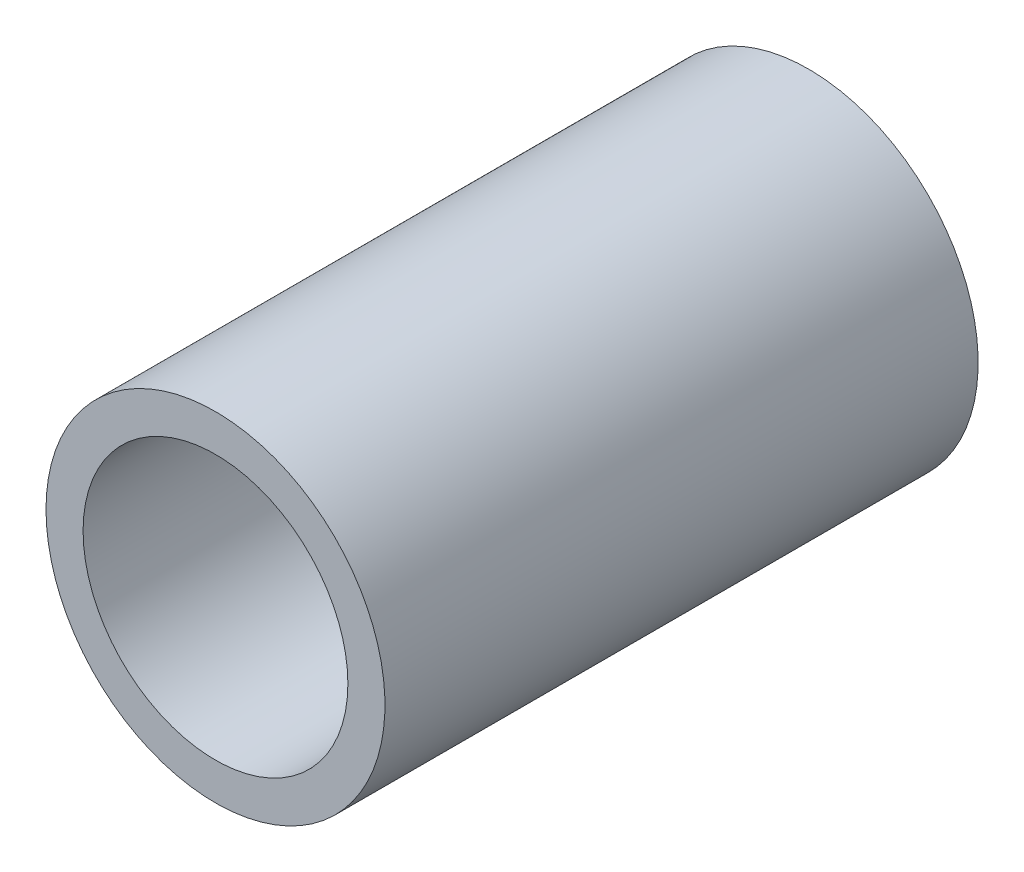
ISO-10303-21;
HEADER;
FILE_DESCRIPTION(('STEP AP214'),'2;1');
FILE_NAME('part.step','',(''),(''),'','','');
FILE_SCHEMA(('AUTOMOTIVE_DESIGN { 1 0 10303 214 1 1 1 1 }'));
ENDSEC;
DATA;
#1=APPLICATION_CONTEXT('core data for automotive mechanical design processes');
#2=APPLICATION_PROTOCOL_DEFINITION('international standard','automotive_design',2000,#1);
#3=PRODUCT_CONTEXT('',#1,'mechanical');
#4=PRODUCT('Part','Part','',(#3));
#5=PRODUCT_RELATED_PRODUCT_CATEGORY('part','',(#4));
#6=PRODUCT_DEFINITION_FORMATION('','',#4);
#7=PRODUCT_DEFINITION_CONTEXT('part definition',#1,'design');
#8=PRODUCT_DEFINITION('design','',#6,#7);
#9=PRODUCT_DEFINITION_SHAPE('','',#8);
#10=(LENGTH_UNIT() NAMED_UNIT(*) SI_UNIT(.MILLI.,.METRE.));
#11=(NAMED_UNIT(*) PLANE_ANGLE_UNIT() SI_UNIT($,.RADIAN.));
#12=(NAMED_UNIT(*) SI_UNIT($,.STERADIAN.) SOLID_ANGLE_UNIT());
#13=UNCERTAINTY_MEASURE_WITH_UNIT(LENGTH_MEASURE(1.E-05),#10,'distance_accuracy_value','');
#14=(GEOMETRIC_REPRESENTATION_CONTEXT(3) GLOBAL_UNCERTAINTY_ASSIGNED_CONTEXT((#13)) GLOBAL_UNIT_ASSIGNED_CONTEXT((#10,
#11,#12)) REPRESENTATION_CONTEXT('',''));
#15=CARTESIAN_POINT('',(0.,0.,0.));
#16=DIRECTION('',(0.,0.,1.));
#17=DIRECTION('',(1.,0.,0.));
#18=AXIS2_PLACEMENT_3D('',#15,#16,#17);
#19=CARTESIAN_POINT('',(-4.44089209850063E-13,8.88178419700125E-13,28.0000000000022));
#20=DIRECTION('',(0.,0.,0.999999999999999));
#21=DIRECTION('',(0.999999999999999,0.,0.));
#22=AXIS2_PLACEMENT_3D('',#19,#20,#21);
#23=PLANE('',#22);
#24=CARTESIAN_POINT('',(-4.44089209850063E-13,8.88178419700125E-13,28.0000000000022));
#25=DIRECTION('',(0.,0.,0.999999999999999));
#26=DIRECTION('',(0.999999999999999,0.,0.));
#27=AXIS2_PLACEMENT_3D('',#24,#25,#26);
#28=CIRCLE('',#27,8.);
#29=CARTESIAN_POINT('',(-8.00000000000043,8.84406019556125E-13,28.0000000000022));
#30=VERTEX_POINT('',#29);
#31=EDGE_CURVE('E10',#30,#30,#28,.T.);
#32=ORIENTED_EDGE('',*,*,#31,.T.);
#33=EDGE_LOOP('',(#32));
#34=FACE_BOUND('',#33,.T.);
#35=CARTESIAN_POINT('',(-4.44089209850063E-13,8.88178419700125E-13,28.0000000000022));
#36=DIRECTION('',(0.,0.,0.999999999999999));
#37=DIRECTION('',(0.999999999999999,0.,0.));
#38=AXIS2_PLACEMENT_3D('',#35,#36,#37);
#39=CIRCLE('',#38,6.25);
#40=CARTESIAN_POINT('',(-6.25000000000044,8.85231232087625E-13,28.0000000000022));
#41=VERTEX_POINT('',#40);
#42=EDGE_CURVE('E39',#41,#41,#39,.T.);
#43=ORIENTED_EDGE('',*,*,#42,.F.);
#44=EDGE_LOOP('',(#43));
#45=FACE_BOUND('',#44,.T.);
#46=ADVANCED_FACE('F28',(#34,#45),#23,.T.);
#47=CARTESIAN_POINT('',(0.,0.,0.));
#48=DIRECTION('',(0.,0.,0.999999999999999));
#49=DIRECTION('',(0.999999999999999,0.,0.));
#50=AXIS2_PLACEMENT_3D('',#47,#48,#49);
#51=PLANE('',#50);
#52=CARTESIAN_POINT('',(0.,0.,0.));
#53=DIRECTION('',(0.,0.,0.999999999999999));
#54=DIRECTION('',(0.999999999999999,0.,0.));
#55=AXIS2_PLACEMENT_3D('',#52,#53,#54);
#56=CIRCLE('',#55,8.);
#57=CARTESIAN_POINT('',(-8.00000000000043,8.8444244874912E-13,0.));
#58=VERTEX_POINT('',#57);
#59=EDGE_CURVE('E32',#58,#58,#56,.T.);
#60=ORIENTED_EDGE('',*,*,#59,.F.);
#61=EDGE_LOOP('',(#60));
#62=FACE_BOUND('',#61,.T.);
#63=CARTESIAN_POINT('',(0.,0.,0.));
#64=DIRECTION('',(0.,0.,0.999999999999999));
#65=DIRECTION('',(0.999999999999999,0.,0.));
#66=AXIS2_PLACEMENT_3D('',#63,#64,#65);
#67=CIRCLE('',#66,6.25);
#68=CARTESIAN_POINT('',(-6.25000000000044,8.8526766128062E-13,0.));
#69=VERTEX_POINT('',#68);
#70=EDGE_CURVE('E41',#69,#69,#67,.T.);
#71=ORIENTED_EDGE('',*,*,#70,.T.);
#72=EDGE_LOOP('',(#71));
#73=FACE_BOUND('',#72,.T.);
#74=ADVANCED_FACE('F51',(#62,#73),#51,.F.);
#75=CARTESIAN_POINT('',(-4.44089209850063E-13,8.88178419700125E-13,28.0000000000022));
#76=DIRECTION('',(0.,0.,-0.999999999999999));
#77=DIRECTION('',(-0.999999999999999,0.,0.));
#78=AXIS2_PLACEMENT_3D('',#75,#76,#77);
#79=CYLINDRICAL_SURFACE('',#78,8.);
#80=CARTESIAN_POINT('',(-8.00000000000043,8.84406019556125E-13,28.0000000000022));
#81=CARTESIAN_POINT('',(-8.00000000000043,8.84406399026885E-13,27.7083333333356));
#82=CARTESIAN_POINT('',(-8.00000000000043,8.84406778497646E-13,27.4166666666689));
#83=CARTESIAN_POINT('',(-8.00000000000043,8.84407537439166E-13,26.8333333333355));
#84=CARTESIAN_POINT('',(-8.00000000000043,8.84407916909927E-13,26.5416666666688));
#85=CARTESIAN_POINT('',(-8.00000000000043,8.84408675851447E-13,25.9583333333354));
#86=CARTESIAN_POINT('',(-8.00000000000043,8.84409055322208E-13,25.6666666666687));
#87=CARTESIAN_POINT('',(-8.00000000000043,8.84409814263729E-13,25.0833333333353));
#88=CARTESIAN_POINT('',(-8.00000000000043,8.84410193734489E-13,24.7916666666687));
#89=CARTESIAN_POINT('',(-8.00000000000043,8.8441095267601E-13,24.2083333333353));
#90=CARTESIAN_POINT('',(-8.00000000000043,8.8441133214677E-13,23.9166666666686));
#91=CARTESIAN_POINT('',(-8.00000000000043,8.84412091088291E-13,23.3333333333352));
#92=CARTESIAN_POINT('',(-8.00000000000043,8.84412470559051E-13,23.0416666666685));
#93=CARTESIAN_POINT('',(-8.00000000000043,8.84413229500572E-13,22.4583333333351));
#94=CARTESIAN_POINT('',(-8.00000000000043,8.84413608971332E-13,22.1666666666684));
#95=CARTESIAN_POINT('',(-8.00000000000043,8.84414367912853E-13,21.5833333333351));
#96=CARTESIAN_POINT('',(-8.00000000000043,8.84414747383613E-13,21.2916666666684));
#97=CARTESIAN_POINT('',(-8.00000000000043,8.84415506325134E-13,20.708333333335));
#98=CARTESIAN_POINT('',(-8.00000000000043,8.84415885795894E-13,20.4166666666683));
#99=CARTESIAN_POINT('',(-8.00000000000043,8.84416644737415E-13,19.8333333333349));
#100=CARTESIAN_POINT('',(-8.00000000000043,8.84417024208176E-13,19.5416666666682));
#101=CARTESIAN_POINT('',(-8.00000000000043,8.84417783149696E-13,18.9583333333349));
#102=CARTESIAN_POINT('',(-8.00000000000043,8.84418162620457E-13,18.6666666666682));
#103=CARTESIAN_POINT('',(-8.00000000000043,8.84418921561977E-13,18.0833333333348));
#104=CARTESIAN_POINT('',(-8.00000000000043,8.84419301032738E-13,17.7916666666681));
#105=CARTESIAN_POINT('',(-8.00000000000043,8.84420059974259E-13,17.2083333333347));
#106=CARTESIAN_POINT('',(-8.00000000000043,8.84420439445019E-13,16.916666666668));
#107=CARTESIAN_POINT('',(-8.00000000000043,8.8442119838654E-13,16.3333333333346));
#108=CARTESIAN_POINT('',(-8.00000000000043,8.844215778573E-13,16.041666666668));
#109=CARTESIAN_POINT('',(-8.00000000000043,8.84422336798821E-13,15.4583333333346));
#110=CARTESIAN_POINT('',(-8.00000000000043,8.84422716269581E-13,15.1666666666679));
#111=CARTESIAN_POINT('',(-8.00000000000043,8.84423475211102E-13,14.5833333333345));
#112=CARTESIAN_POINT('',(-8.00000000000043,8.84423854681862E-13,14.2916666666678));
#113=CARTESIAN_POINT('',(-8.00000000000043,8.84424613623383E-13,13.7083333333344));
#114=CARTESIAN_POINT('',(-8.00000000000043,8.84424993094143E-13,13.4166666666677));
#115=CARTESIAN_POINT('',(-8.00000000000043,8.84425752035664E-13,12.8333333333344));
#116=CARTESIAN_POINT('',(-8.00000000000043,8.84426131506425E-13,12.5416666666677));
#117=CARTESIAN_POINT('',(-8.00000000000043,8.84426890447945E-13,11.9583333333343));
#118=CARTESIAN_POINT('',(-8.00000000000043,8.84427269918706E-13,11.6666666666676));
#119=CARTESIAN_POINT('',(-8.00000000000043,8.84428028860226E-13,11.0833333333342));
#120=CARTESIAN_POINT('',(-8.00000000000043,8.84428408330987E-13,10.7916666666675));
#121=CARTESIAN_POINT('',(-8.00000000000043,8.84429167272507E-13,10.2083333333342));
#122=CARTESIAN_POINT('',(-8.00000000000043,8.84429546743268E-13,9.91666666666747));
#123=CARTESIAN_POINT('',(-8.00000000000043,8.84430305684789E-13,9.33333333333409));
#124=CARTESIAN_POINT('',(-8.00000000000043,8.84430685155549E-13,9.04166666666739));
#125=CARTESIAN_POINT('',(-8.00000000000043,8.8443144409707E-13,8.45833333333401));
#126=CARTESIAN_POINT('',(-8.00000000000043,8.8443182356783E-13,8.16666666666733));
#127=CARTESIAN_POINT('',(-8.00000000000043,8.84432582509351E-13,7.58333333333394));
#128=CARTESIAN_POINT('',(-8.00000000000043,8.84432961980111E-13,7.29166666666725));
#129=CARTESIAN_POINT('',(-8.00000000000043,8.84433720921632E-13,6.70833333333387));
#130=CARTESIAN_POINT('',(-8.00000000000043,8.84434100392392E-13,6.41666666666718));
#131=CARTESIAN_POINT('',(-8.00000000000043,8.84434859333913E-13,5.8333333333338));
#132=CARTESIAN_POINT('',(-8.00000000000043,8.84435238804673E-13,5.54166666666711));
#133=CARTESIAN_POINT('',(-8.00000000000043,8.84435997746194E-13,4.95833333333373));
#134=CARTESIAN_POINT('',(-8.00000000000043,8.84436377216955E-13,4.66666666666704));
#135=CARTESIAN_POINT('',(-8.00000000000043,8.84437136158475E-13,4.08333333333366));
#136=CARTESIAN_POINT('',(-8.00000000000043,8.84437515629236E-13,3.79166666666697));
#137=CARTESIAN_POINT('',(-8.00000000000043,8.84438274570756E-13,3.20833333333359));
#138=CARTESIAN_POINT('',(-8.00000000000043,8.84438654041517E-13,2.9166666666669));
#139=CARTESIAN_POINT('',(-8.00000000000043,8.84439412983037E-13,2.33333333333352));
#140=CARTESIAN_POINT('',(-8.00000000000043,8.84439792453798E-13,2.04166666666683));
#141=CARTESIAN_POINT('',(-8.00000000000043,8.84440551395318E-13,1.45833333333345));
#142=CARTESIAN_POINT('',(-8.00000000000043,8.84440930866079E-13,1.16666666666676));
#143=CARTESIAN_POINT('',(-8.00000000000043,8.844416898076E-13,0.583333333333383));
#144=CARTESIAN_POINT('',(-8.00000000000043,8.8444206927836E-13,0.291666666666693));
#145=CARTESIAN_POINT('',(-8.00000000000043,8.8444244874912E-13,0.));
#146=B_SPLINE_CURVE_WITH_KNOTS('',3,(#80,#81,#82,#83,#84,#85,#86,#87,#88,#89,#90,#91,#92,#93,
#94,#95,#96,#97,#98,#99,#100,#101,#102,#103,#104,#105,#106,#107,#108,#109,#110,#111,#112,#113,
#114,#115,#116,#117,#118,#119,#120,#121,#122,#123,#124,#125,#126,#127,#128,#129,#130,#131,#132,
#133,#134,#135,#136,#137,#138,#139,#140,#141,#142,#143,#144,#145),.UNSPECIFIED.,.F.,.F.,(4,2,2,
2,2,2,2,2,2,2,2,2,2,2,2,2,2,2,2,2,2,2,2,2,2,2,2,2,2,2,2,2,4),(0.,0.875000000000074,
1.75000000000014,2.62500000000021,3.50000000000028,4.37500000000035,5.25000000000042,
6.12500000000049,7.00000000000056,7.87500000000064,8.75000000000071,9.62500000000077,
10.5000000000008,11.3750000000009,12.250000000001,13.1250000000011,14.0000000000011,
14.8750000000012,15.7500000000013,16.6250000000013,17.5000000000014,18.3750000000015,
19.2500000000015,20.1250000000016,21.0000000000017,21.8750000000018,22.7500000000018,
23.6250000000019,24.500000000002,25.375000000002,26.2500000000021,27.1250000000022,
28.0000000000022),.UNSPECIFIED.);
#147=EDGE_CURVE('BSEAM30',#30,#58,#146,.T.);
#148=ORIENTED_EDGE('',*,*,#31,.F.);
#149=ORIENTED_EDGE('',*,*,#59,.T.);
#150=ORIENTED_EDGE('',*,*,#147,.T.);
#151=ORIENTED_EDGE('',*,*,#147,.F.);
#152=EDGE_LOOP('',(#148,#150,#149,#151));
#153=FACE_BOUND('',#152,.T.);
#154=ADVANCED_FACE('F30',(#153),#79,.T.);
#155=CARTESIAN_POINT('',(-4.44089209850063E-13,8.88178419700125E-13,28.0000000000022));
#156=DIRECTION('',(0.,0.,-0.999999999999999));
#157=DIRECTION('',(-0.999999999999999,0.,0.));
#158=AXIS2_PLACEMENT_3D('',#155,#156,#157);
#159=CYLINDRICAL_SURFACE('',#158,6.25);
#160=CARTESIAN_POINT('',(-6.25000000000044,8.85231232087625E-13,28.0000000000022));
#161=CARTESIAN_POINT('',(-6.25000000000044,8.85231611558385E-13,27.7083333333356));
#162=CARTESIAN_POINT('',(-6.25000000000044,8.85231991029146E-13,27.4166666666689));
#163=CARTESIAN_POINT('',(-6.25000000000044,8.85232749970666E-13,26.8333333333355));
#164=CARTESIAN_POINT('',(-6.25000000000044,8.85233129441427E-13,26.5416666666688));
#165=CARTESIAN_POINT('',(-6.25000000000044,8.85233888382947E-13,25.9583333333354));
#166=CARTESIAN_POINT('',(-6.25000000000044,8.85234267853708E-13,25.6666666666687));
#167=CARTESIAN_POINT('',(-6.25000000000044,8.85235026795229E-13,25.0833333333353));
#168=CARTESIAN_POINT('',(-6.25000000000044,8.85235406265989E-13,24.7916666666687));
#169=CARTESIAN_POINT('',(-6.25000000000044,8.8523616520751E-13,24.2083333333353));
#170=CARTESIAN_POINT('',(-6.25000000000044,8.8523654467827E-13,23.9166666666686));
#171=CARTESIAN_POINT('',(-6.25000000000044,8.85237303619791E-13,23.3333333333352));
#172=CARTESIAN_POINT('',(-6.25000000000044,8.85237683090551E-13,23.0416666666685));
#173=CARTESIAN_POINT('',(-6.25000000000044,8.85238442032072E-13,22.4583333333351));
#174=CARTESIAN_POINT('',(-6.25000000000044,8.85238821502832E-13,22.1666666666684));
#175=CARTESIAN_POINT('',(-6.25000000000044,8.85239580444353E-13,21.5833333333351));
#176=CARTESIAN_POINT('',(-6.25000000000044,8.85239959915113E-13,21.2916666666684));
#177=CARTESIAN_POINT('',(-6.25000000000044,8.85240718856634E-13,20.708333333335));
#178=CARTESIAN_POINT('',(-6.25000000000044,8.85241098327395E-13,20.4166666666683));
#179=CARTESIAN_POINT('',(-6.25000000000044,8.85241857268915E-13,19.8333333333349));
#180=CARTESIAN_POINT('',(-6.25000000000044,8.85242236739676E-13,19.5416666666682));
#181=CARTESIAN_POINT('',(-6.25000000000044,8.85242995681196E-13,18.9583333333349));
#182=CARTESIAN_POINT('',(-6.25000000000044,8.85243375151957E-13,18.6666666666682));
#183=CARTESIAN_POINT('',(-6.25000000000044,8.85244134093477E-13,18.0833333333348));
#184=CARTESIAN_POINT('',(-6.25000000000044,8.85244513564238E-13,17.7916666666681));
#185=CARTESIAN_POINT('',(-6.25000000000044,8.85245272505759E-13,17.2083333333347));
#186=CARTESIAN_POINT('',(-6.25000000000044,8.85245651976519E-13,16.916666666668));
#187=CARTESIAN_POINT('',(-6.25000000000044,8.8524641091804E-13,16.3333333333346));
#188=CARTESIAN_POINT('',(-6.25000000000044,8.852467903888E-13,16.041666666668));
#189=CARTESIAN_POINT('',(-6.25000000000044,8.85247549330321E-13,15.4583333333346));
#190=CARTESIAN_POINT('',(-6.25000000000044,8.85247928801081E-13,15.1666666666679));
#191=CARTESIAN_POINT('',(-6.25000000000044,8.85248687742602E-13,14.5833333333345));
#192=CARTESIAN_POINT('',(-6.25000000000044,8.85249067213362E-13,14.2916666666678));
#193=CARTESIAN_POINT('',(-6.25000000000044,8.85249826154883E-13,13.7083333333344));
#194=CARTESIAN_POINT('',(-6.25000000000044,8.85250205625643E-13,13.4166666666677));
#195=CARTESIAN_POINT('',(-6.25000000000044,8.85250964567164E-13,12.8333333333344));
#196=CARTESIAN_POINT('',(-6.25000000000044,8.85251344037925E-13,12.5416666666677));
#197=CARTESIAN_POINT('',(-6.25000000000044,8.85252102979445E-13,11.9583333333343));
#198=CARTESIAN_POINT('',(-6.25000000000044,8.85252482450206E-13,11.6666666666676));
#199=CARTESIAN_POINT('',(-6.25000000000044,8.85253241391726E-13,11.0833333333342));
#200=CARTESIAN_POINT('',(-6.25000000000044,8.85253620862487E-13,10.7916666666675));
#201=CARTESIAN_POINT('',(-6.25000000000044,8.85254379804007E-13,10.2083333333342));
#202=CARTESIAN_POINT('',(-6.25000000000044,8.85254759274768E-13,9.91666666666747));
#203=CARTESIAN_POINT('',(-6.25000000000044,8.85255518216289E-13,9.33333333333409));
#204=CARTESIAN_POINT('',(-6.25000000000044,8.85255897687049E-13,9.04166666666739));
#205=CARTESIAN_POINT('',(-6.25000000000044,8.8525665662857E-13,8.45833333333401));
#206=CARTESIAN_POINT('',(-6.25000000000044,8.8525703609933E-13,8.16666666666733));
#207=CARTESIAN_POINT('',(-6.25000000000044,8.85257795040851E-13,7.58333333333394));
#208=CARTESIAN_POINT('',(-6.25000000000044,8.85258174511611E-13,7.29166666666725));
#209=CARTESIAN_POINT('',(-6.25000000000044,8.85258933453132E-13,6.70833333333387));
#210=CARTESIAN_POINT('',(-6.25000000000044,8.85259312923892E-13,6.41666666666718));
#211=CARTESIAN_POINT('',(-6.25000000000044,8.85260071865413E-13,5.8333333333338));
#212=CARTESIAN_POINT('',(-6.25000000000044,8.85260451336173E-13,5.54166666666711));
#213=CARTESIAN_POINT('',(-6.25000000000044,8.85261210277694E-13,4.95833333333373));
#214=CARTESIAN_POINT('',(-6.25000000000044,8.85261589748455E-13,4.66666666666704));
#215=CARTESIAN_POINT('',(-6.25000000000044,8.85262348689975E-13,4.08333333333366));
#216=CARTESIAN_POINT('',(-6.25000000000044,8.85262728160736E-13,3.79166666666697));
#217=CARTESIAN_POINT('',(-6.25000000000044,8.85263487102256E-13,3.20833333333359));
#218=CARTESIAN_POINT('',(-6.25000000000044,8.85263866573017E-13,2.9166666666669));
#219=CARTESIAN_POINT('',(-6.25000000000044,8.85264625514537E-13,2.33333333333352));
#220=CARTESIAN_POINT('',(-6.25000000000044,8.85265004985298E-13,2.04166666666683));
#221=CARTESIAN_POINT('',(-6.25000000000044,8.85265763926819E-13,1.45833333333345));
#222=CARTESIAN_POINT('',(-6.25000000000044,8.85266143397579E-13,1.16666666666676));
#223=CARTESIAN_POINT('',(-6.25000000000044,8.852669023391E-13,0.583333333333383));
#224=CARTESIAN_POINT('',(-6.25000000000044,8.8526728180986E-13,0.291666666666693));
#225=CARTESIAN_POINT('',(-6.25000000000044,8.8526766128062E-13,0.));
#226=B_SPLINE_CURVE_WITH_KNOTS('',3,(#160,#161,#162,#163,#164,#165,#166,#167,#168,#169,#170,
#171,#172,#173,#174,#175,#176,#177,#178,#179,#180,#181,#182,#183,#184,#185,#186,#187,#188,#189,
#190,#191,#192,#193,#194,#195,#196,#197,#198,#199,#200,#201,#202,#203,#204,#205,#206,#207,#208,
#209,#210,#211,#212,#213,#214,#215,#216,#217,#218,#219,#220,#221,#222,#223,#224,#225),
.UNSPECIFIED.,.F.,.F.,(4,2,2,2,2,2,2,2,2,2,2,2,2,2,2,2,2,2,2,2,2,2,2,2,2,2,2,2,2,2,2,2,4),(0.,
0.875000000000074,1.75000000000014,2.62500000000021,3.50000000000028,4.37500000000035,
5.25000000000042,6.12500000000049,7.00000000000056,7.87500000000064,8.75000000000071,
9.62500000000077,10.5000000000008,11.3750000000009,12.250000000001,13.1250000000011,
14.0000000000011,14.8750000000012,15.7500000000013,16.6250000000013,17.5000000000014,
18.3750000000015,19.2500000000015,20.1250000000016,21.0000000000017,21.8750000000018,
22.7500000000018,23.6250000000019,24.500000000002,25.375000000002,26.2500000000021,
27.1250000000022,28.0000000000022),.UNSPECIFIED.);
#227=EDGE_CURVE('BSEAM47',#41,#69,#226,.T.);
#228=ORIENTED_EDGE('',*,*,#42,.T.);
#229=ORIENTED_EDGE('',*,*,#70,.F.);
#230=ORIENTED_EDGE('',*,*,#227,.T.);
#231=ORIENTED_EDGE('',*,*,#227,.F.);
#232=EDGE_LOOP('',(#228,#230,#229,#231));
#233=FACE_BOUND('',#232,.T.);
#234=ADVANCED_FACE('F47',(#233),#159,.F.);
#235=CLOSED_SHELL('',(#46,#74,#154,#234));
#236=MANIFOLD_SOLID_BREP('B2',#235);
#237=ADVANCED_BREP_SHAPE_REPRESENTATION('',(#18,#236),#14);
#238=SHAPE_DEFINITION_REPRESENTATION(#9,#237);
ENDSEC;
END-ISO-10303-21;
